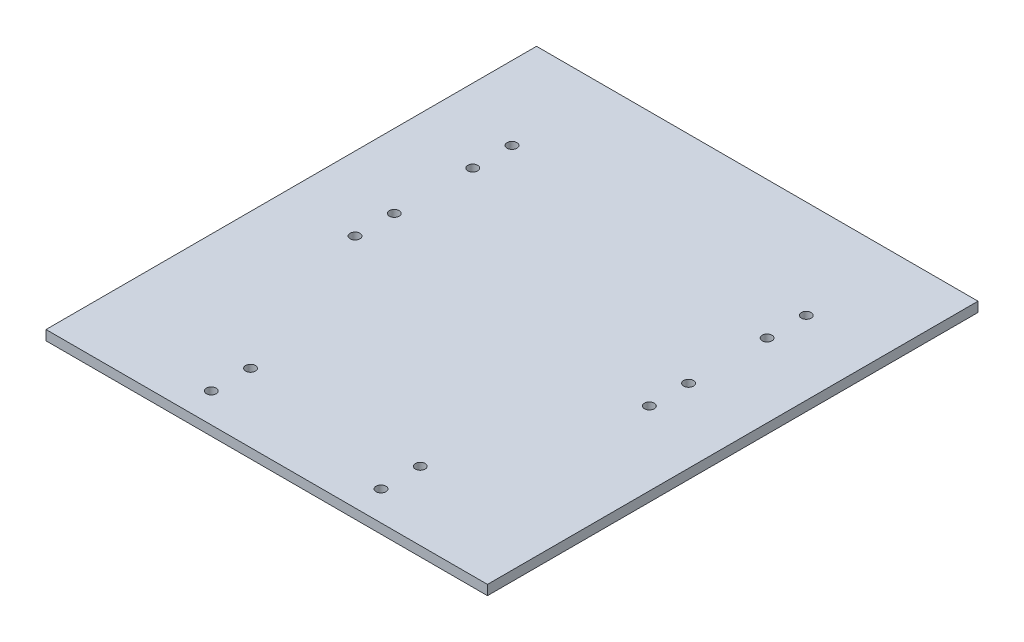
ISO-10303-21;
HEADER;
FILE_DESCRIPTION(('STEP AP214'),'2;1');
FILE_NAME('part.step','',(''),(''),'','','');
FILE_SCHEMA(('AUTOMOTIVE_DESIGN { 1 0 10303 214 1 1 1 1 }'));
ENDSEC;
DATA;
#1=APPLICATION_CONTEXT('core data for automotive mechanical design processes');
#2=APPLICATION_PROTOCOL_DEFINITION('international standard','automotive_design',2000,#1);
#3=PRODUCT_CONTEXT('',#1,'mechanical');
#4=PRODUCT('Part','Part','',(#3));
#5=PRODUCT_RELATED_PRODUCT_CATEGORY('part','',(#4));
#6=PRODUCT_DEFINITION_FORMATION('','',#4);
#7=PRODUCT_DEFINITION_CONTEXT('part definition',#1,'design');
#8=PRODUCT_DEFINITION('design','',#6,#7);
#9=PRODUCT_DEFINITION_SHAPE('','',#8);
#10=(LENGTH_UNIT() NAMED_UNIT(*) SI_UNIT(.MILLI.,.METRE.));
#11=(NAMED_UNIT(*) PLANE_ANGLE_UNIT() SI_UNIT($,.RADIAN.));
#12=(NAMED_UNIT(*) SI_UNIT($,.STERADIAN.) SOLID_ANGLE_UNIT());
#13=UNCERTAINTY_MEASURE_WITH_UNIT(LENGTH_MEASURE(1.E-05),#10,'distance_accuracy_value','');
#14=(GEOMETRIC_REPRESENTATION_CONTEXT(3) GLOBAL_UNCERTAINTY_ASSIGNED_CONTEXT((#13)) GLOBAL_UNIT_ASSIGNED_CONTEXT((#10,
#11,#12)) REPRESENTATION_CONTEXT('',''));
#15=CARTESIAN_POINT('',(0.,0.,0.));
#16=DIRECTION('',(0.,0.,1.));
#17=DIRECTION('',(1.,0.,0.));
#18=AXIS2_PLACEMENT_3D('',#15,#16,#17);
#19=CARTESIAN_POINT('',(-112.5,5.,125.));
#20=DIRECTION('',(1.,0.,0.));
#21=DIRECTION('',(0.,0.,-1.));
#22=AXIS2_PLACEMENT_3D('',#19,#20,#21);
#23=PLANE('',#22);
#24=DIRECTION('',(0.,0.,1.));
#25=VECTOR('',#24,1.);
#26=CARTESIAN_POINT('',(-112.5,0.,125.));
#27=LINE('',#26,#25);
#28=CARTESIAN_POINT('',(-112.5,0.,-125.));
#29=VERTEX_POINT('',#28);
#30=CARTESIAN_POINT('',(-112.5,0.,125.));
#31=VERTEX_POINT('',#30);
#32=EDGE_CURVE('E98',#29,#31,#27,.T.);
#33=ORIENTED_EDGE('',*,*,#32,.T.);
#34=DIRECTION('',(0.,-1.,0.));
#35=VECTOR('',#34,1.);
#36=CARTESIAN_POINT('',(-112.5,5.,125.));
#37=LINE('',#36,#35);
#38=CARTESIAN_POINT('',(-112.5,5.,125.));
#39=VERTEX_POINT('',#38);
#40=EDGE_CURVE('E11',#39,#31,#37,.T.);
#41=ORIENTED_EDGE('',*,*,#40,.F.);
#42=DIRECTION('',(0.,0.,1.));
#43=VECTOR('',#42,1.);
#44=CARTESIAN_POINT('',(-112.5,5.,125.));
#45=LINE('',#44,#43);
#46=CARTESIAN_POINT('',(-112.5,5.,-125.));
#47=VERTEX_POINT('',#46);
#48=EDGE_CURVE('E86',#47,#39,#45,.T.);
#49=ORIENTED_EDGE('',*,*,#48,.F.);
#50=DIRECTION('',(0.,-1.,0.));
#51=VECTOR('',#50,1.);
#52=CARTESIAN_POINT('',(-112.5,5.,-125.));
#53=LINE('',#52,#51);
#54=EDGE_CURVE('E94',#47,#29,#53,.T.);
#55=ORIENTED_EDGE('',*,*,#54,.T.);
#56=EDGE_LOOP('',(#33,#41,#49,#55));
#57=FACE_BOUND('',#56,.T.);
#58=ADVANCED_FACE('F35',(#57),#23,.F.);
#59=CARTESIAN_POINT('',(112.5,5.,125.));
#60=DIRECTION('',(0.,0.,-1.));
#61=DIRECTION('',(-1.,0.,0.));
#62=AXIS2_PLACEMENT_3D('',#59,#60,#61);
#63=PLANE('',#62);
#64=DIRECTION('',(1.,0.,0.));
#65=VECTOR('',#64,1.);
#66=CARTESIAN_POINT('',(112.5,0.,125.));
#67=LINE('',#66,#65);
#68=CARTESIAN_POINT('',(112.5,0.,125.));
#69=VERTEX_POINT('',#68);
#70=EDGE_CURVE('E90',#31,#69,#67,.T.);
#71=ORIENTED_EDGE('',*,*,#70,.T.);
#72=DIRECTION('',(0.,-1.,0.));
#73=VECTOR('',#72,1.);
#74=CARTESIAN_POINT('',(112.5,5.,125.));
#75=LINE('',#74,#73);
#76=CARTESIAN_POINT('',(112.5,5.,125.));
#77=VERTEX_POINT('',#76);
#78=EDGE_CURVE('E43',#77,#69,#75,.T.);
#79=ORIENTED_EDGE('',*,*,#78,.F.);
#80=DIRECTION('',(1.,0.,0.));
#81=VECTOR('',#80,1.);
#82=CARTESIAN_POINT('',(112.5,5.,125.));
#83=LINE('',#82,#81);
#84=EDGE_CURVE('E81',#39,#77,#83,.T.);
#85=ORIENTED_EDGE('',*,*,#84,.F.);
#86=ORIENTED_EDGE('',*,*,#40,.T.);
#87=EDGE_LOOP('',(#71,#79,#85,#86));
#88=FACE_BOUND('',#87,.T.);
#89=ADVANCED_FACE('F89',(#88),#63,.F.);
#90=CARTESIAN_POINT('',(112.5,5.,125.));
#91=DIRECTION('',(-1.,0.,0.));
#92=DIRECTION('',(0.,0.,1.));
#93=AXIS2_PLACEMENT_3D('',#90,#91,#92);
#94=PLANE('',#93);
#95=DIRECTION('',(0.,0.,-1.));
#96=VECTOR('',#95,1.);
#97=CARTESIAN_POINT('',(112.5,0.,125.));
#98=LINE('',#97,#96);
#99=CARTESIAN_POINT('',(112.5,0.,-125.));
#100=VERTEX_POINT('',#99);
#101=EDGE_CURVE('E68',#69,#100,#98,.T.);
#102=ORIENTED_EDGE('',*,*,#101,.T.);
#103=DIRECTION('',(0.,-1.,0.));
#104=VECTOR('',#103,1.);
#105=CARTESIAN_POINT('',(112.5,5.,-125.));
#106=LINE('',#105,#104);
#107=CARTESIAN_POINT('',(112.5,5.,-125.));
#108=VERTEX_POINT('',#107);
#109=EDGE_CURVE('E91',#108,#100,#106,.T.);
#110=ORIENTED_EDGE('',*,*,#109,.F.);
#111=DIRECTION('',(0.,0.,-1.));
#112=VECTOR('',#111,1.);
#113=CARTESIAN_POINT('',(112.5,5.,125.));
#114=LINE('',#113,#112);
#115=EDGE_CURVE('E84',#77,#108,#114,.T.);
#116=ORIENTED_EDGE('',*,*,#115,.F.);
#117=ORIENTED_EDGE('',*,*,#78,.T.);
#118=EDGE_LOOP('',(#102,#110,#116,#117));
#119=FACE_BOUND('',#118,.T.);
#120=ADVANCED_FACE('F92',(#119),#94,.F.);
#121=CARTESIAN_POINT('',(112.5,5.,-125.));
#122=DIRECTION('',(0.,0.,1.));
#123=DIRECTION('',(1.,0.,0.));
#124=AXIS2_PLACEMENT_3D('',#121,#122,#123);
#125=PLANE('',#124);
#126=DIRECTION('',(-1.,0.,0.));
#127=VECTOR('',#126,1.);
#128=CARTESIAN_POINT('',(112.5,0.,-125.));
#129=LINE('',#128,#127);
#130=EDGE_CURVE('E74',#100,#29,#129,.T.);
#131=ORIENTED_EDGE('',*,*,#130,.T.);
#132=ORIENTED_EDGE('',*,*,#54,.F.);
#133=DIRECTION('',(-1.,0.,0.));
#134=VECTOR('',#133,1.);
#135=CARTESIAN_POINT('',(112.5,5.,-125.));
#136=LINE('',#135,#134);
#137=EDGE_CURVE('E51',#108,#47,#136,.T.);
#138=ORIENTED_EDGE('',*,*,#137,.F.);
#139=ORIENTED_EDGE('',*,*,#109,.T.);
#140=EDGE_LOOP('',(#131,#132,#138,#139));
#141=FACE_BOUND('',#140,.T.);
#142=ADVANCED_FACE('F106',(#141),#125,.F.);
#143=CARTESIAN_POINT('',(0.,5.,0.));
#144=DIRECTION('',(0.,1.,0.));
#145=DIRECTION('',(0.,0.,1.));
#146=AXIS2_PLACEMENT_3D('',#143,#144,#145);
#147=PLANE('',#146);
#148=CARTESIAN_POINT('',(-43.25,5.,110.));
#149=DIRECTION('',(0.,1.,0.));
#150=DIRECTION('',(0.,0.,1.));
#151=AXIS2_PLACEMENT_3D('',#148,#149,#150);
#152=CIRCLE('',#151,2.5);
#153=CARTESIAN_POINT('',(-43.25,5.,112.5));
#154=VERTEX_POINT('',#153);
#155=EDGE_CURVE('E173',#154,#154,#152,.T.);
#156=ORIENTED_EDGE('',*,*,#155,.F.);
#157=EDGE_LOOP('',(#156));
#158=FACE_BOUND('',#157,.T.);
#159=CARTESIAN_POINT('',(43.2500000000033,5.,90.));
#160=DIRECTION('',(0.,1.,0.));
#161=DIRECTION('',(0.,0.,-1.));
#162=AXIS2_PLACEMENT_3D('',#159,#160,#161);
#163=CIRCLE('',#162,2.49999999999994);
#164=CARTESIAN_POINT('',(43.2500000000033,5.,87.5000000000001));
#165=VERTEX_POINT('',#164);
#166=EDGE_CURVE('E166',#165,#165,#163,.T.);
#167=ORIENTED_EDGE('',*,*,#166,.F.);
#168=EDGE_LOOP('',(#167));
#169=FACE_BOUND('',#168,.T.);
#170=CARTESIAN_POINT('',(43.25,5.,110.));
#171=DIRECTION('',(0.,1.,0.));
#172=DIRECTION('',(0.,0.,-1.));
#173=AXIS2_PLACEMENT_3D('',#170,#171,#172);
#174=CIRCLE('',#173,2.49999999999992);
#175=CARTESIAN_POINT('',(43.25,5.,107.5));
#176=VERTEX_POINT('',#175);
#177=EDGE_CURVE('E178',#176,#176,#174,.T.);
#178=ORIENTED_EDGE('',*,*,#177,.F.);
#179=EDGE_LOOP('',(#178));
#180=FACE_BOUND('',#179,.T.);
#181=CARTESIAN_POINT('',(-43.25,5.,90.));
#182=DIRECTION('',(0.,1.,0.));
#183=DIRECTION('',(0.,0.,1.));
#184=AXIS2_PLACEMENT_3D('',#181,#182,#183);
#185=CIRCLE('',#184,2.5);
#186=CARTESIAN_POINT('',(-43.25,5.,92.5));
#187=VERTEX_POINT('',#186);
#188=EDGE_CURVE('E160',#187,#187,#185,.T.);
#189=ORIENTED_EDGE('',*,*,#188,.F.);
#190=EDGE_LOOP('',(#189));
#191=FACE_BOUND('',#190,.T.);
#192=CARTESIAN_POINT('',(75.0000000000133,5.,4.99999999999999));
#193=DIRECTION('',(0.,1.,0.));
#194=DIRECTION('',(0.,0.,1.));
#195=AXIS2_PLACEMENT_3D('',#192,#193,#194);
#196=CIRCLE('',#195,2.49999999999999);
#197=CARTESIAN_POINT('',(75.0000000000133,5.,7.49999999999998));
#198=VERTEX_POINT('',#197);
#199=EDGE_CURVE('E130',#198,#198,#196,.T.);
#200=ORIENTED_EDGE('',*,*,#199,.F.);
#201=EDGE_LOOP('',(#200));
#202=FACE_BOUND('',#201,.T.);
#203=CARTESIAN_POINT('',(75.0000000000133,5.,-75.));
#204=DIRECTION('',(0.,1.,0.));
#205=DIRECTION('',(0.,0.,-1.));
#206=AXIS2_PLACEMENT_3D('',#203,#204,#205);
#207=CIRCLE('',#206,2.5);
#208=CARTESIAN_POINT('',(75.0000000000133,5.,-77.5));
#209=VERTEX_POINT('',#208);
#210=EDGE_CURVE('E137',#209,#209,#207,.T.);
#211=ORIENTED_EDGE('',*,*,#210,.F.);
#212=EDGE_LOOP('',(#211));
#213=FACE_BOUND('',#212,.T.);
#214=CARTESIAN_POINT('',(75.0000000000133,5.,-55.));
#215=DIRECTION('',(0.,1.,0.));
#216=DIRECTION('',(0.,0.,-1.));
#217=AXIS2_PLACEMENT_3D('',#214,#215,#216);
#218=CIRCLE('',#217,2.50000000000001);
#219=CARTESIAN_POINT('',(75.0000000000133,5.,-57.5));
#220=VERTEX_POINT('',#219);
#221=EDGE_CURVE('E118',#220,#220,#218,.T.);
#222=ORIENTED_EDGE('',*,*,#221,.F.);
#223=EDGE_LOOP('',(#222));
#224=FACE_BOUND('',#223,.T.);
#225=CARTESIAN_POINT('',(-75.0000000000133,5.,-55.));
#226=DIRECTION('',(0.,1.,0.));
#227=DIRECTION('',(0.,0.,1.));
#228=AXIS2_PLACEMENT_3D('',#225,#226,#227);
#229=CIRCLE('',#228,2.50000000000001);
#230=CARTESIAN_POINT('',(-75.0000000000133,5.,-52.5));
#231=VERTEX_POINT('',#230);
#232=EDGE_CURVE('E125',#231,#231,#229,.T.);
#233=ORIENTED_EDGE('',*,*,#232,.F.);
#234=EDGE_LOOP('',(#233));
#235=FACE_BOUND('',#234,.T.);
#236=CARTESIAN_POINT('',(-75.0000000000133,5.,-15.));
#237=DIRECTION('',(0.,1.,0.));
#238=DIRECTION('',(0.,0.,-1.));
#239=AXIS2_PLACEMENT_3D('',#236,#237,#238);
#240=CIRCLE('',#239,2.50000000000001);
#241=CARTESIAN_POINT('',(-75.0000000000133,5.,-17.5));
#242=VERTEX_POINT('',#241);
#243=EDGE_CURVE('E154',#242,#242,#240,.T.);
#244=ORIENTED_EDGE('',*,*,#243,.F.);
#245=EDGE_LOOP('',(#244));
#246=FACE_BOUND('',#245,.T.);
#247=CARTESIAN_POINT('',(-75.0000000000133,5.,4.99999999999999));
#248=DIRECTION('',(0.,1.,0.));
#249=DIRECTION('',(0.,0.,-1.));
#250=AXIS2_PLACEMENT_3D('',#247,#248,#249);
#251=CIRCLE('',#250,2.49999999999999);
#252=CARTESIAN_POINT('',(-75.0000000000133,5.,2.5));
#253=VERTEX_POINT('',#252);
#254=EDGE_CURVE('E142',#253,#253,#251,.T.);
#255=ORIENTED_EDGE('',*,*,#254,.F.);
#256=EDGE_LOOP('',(#255));
#257=FACE_BOUND('',#256,.T.);
#258=CARTESIAN_POINT('',(75.0000000000133,5.,-15.));
#259=DIRECTION('',(0.,1.,0.));
#260=DIRECTION('',(0.,0.,1.));
#261=AXIS2_PLACEMENT_3D('',#258,#259,#260);
#262=CIRCLE('',#261,2.50000000000001);
#263=CARTESIAN_POINT('',(75.0000000000133,5.,-12.5));
#264=VERTEX_POINT('',#263);
#265=EDGE_CURVE('E149',#264,#264,#262,.T.);
#266=ORIENTED_EDGE('',*,*,#265,.F.);
#267=EDGE_LOOP('',(#266));
#268=FACE_BOUND('',#267,.T.);
#269=CARTESIAN_POINT('',(-75.0000000000133,5.,-75.));
#270=DIRECTION('',(0.,1.,0.));
#271=DIRECTION('',(0.,0.,1.));
#272=AXIS2_PLACEMENT_3D('',#269,#270,#271);
#273=CIRCLE('',#272,2.5);
#274=CARTESIAN_POINT('',(-75.0000000000133,5.,-72.5));
#275=VERTEX_POINT('',#274);
#276=EDGE_CURVE('E112',#275,#275,#273,.T.);
#277=ORIENTED_EDGE('',*,*,#276,.F.);
#278=EDGE_LOOP('',(#277));
#279=FACE_BOUND('',#278,.T.);
#280=ORIENTED_EDGE('',*,*,#48,.T.);
#281=ORIENTED_EDGE('',*,*,#84,.T.);
#282=ORIENTED_EDGE('',*,*,#115,.T.);
#283=ORIENTED_EDGE('',*,*,#137,.T.);
#284=EDGE_LOOP('',(#280,#281,#282,#283));
#285=FACE_BOUND('',#284,.T.);
#286=ADVANCED_FACE('F82',(#158,#169,#180,#191,#202,#213,#224,#235,#246,#257,#268,#279,#285),
#147,.T.);
#287=CARTESIAN_POINT('',(0.,0.,0.));
#288=DIRECTION('',(0.,1.,0.));
#289=DIRECTION('',(0.,0.,1.));
#290=AXIS2_PLACEMENT_3D('',#287,#288,#289);
#291=PLANE('',#290);
#292=CARTESIAN_POINT('',(-43.25,0.,110.));
#293=DIRECTION('',(0.,1.,0.));
#294=DIRECTION('',(0.,0.,1.));
#295=AXIS2_PLACEMENT_3D('',#292,#293,#294);
#296=CIRCLE('',#295,2.5);
#297=CARTESIAN_POINT('',(-43.25,0.,112.5));
#298=VERTEX_POINT('',#297);
#299=EDGE_CURVE('E163',#298,#298,#296,.T.);
#300=ORIENTED_EDGE('',*,*,#299,.T.);
#301=EDGE_LOOP('',(#300));
#302=FACE_BOUND('',#301,.T.);
#303=CARTESIAN_POINT('',(43.2500000000033,0.,90.));
#304=DIRECTION('',(0.,1.,0.));
#305=DIRECTION('',(0.,0.,-1.));
#306=AXIS2_PLACEMENT_3D('',#303,#304,#305);
#307=CIRCLE('',#306,2.49999999999994);
#308=CARTESIAN_POINT('',(43.2500000000033,0.,87.5000000000001));
#309=VERTEX_POINT('',#308);
#310=EDGE_CURVE('E169',#309,#309,#307,.T.);
#311=ORIENTED_EDGE('',*,*,#310,.T.);
#312=EDGE_LOOP('',(#311));
#313=FACE_BOUND('',#312,.T.);
#314=CARTESIAN_POINT('',(43.25,0.,110.));
#315=DIRECTION('',(0.,1.,0.));
#316=DIRECTION('',(0.,0.,-1.));
#317=AXIS2_PLACEMENT_3D('',#314,#315,#316);
#318=CIRCLE('',#317,2.49999999999992);
#319=CARTESIAN_POINT('',(43.25,0.,107.5));
#320=VERTEX_POINT('',#319);
#321=EDGE_CURVE('E170',#320,#320,#318,.T.);
#322=ORIENTED_EDGE('',*,*,#321,.T.);
#323=EDGE_LOOP('',(#322));
#324=FACE_BOUND('',#323,.T.);
#325=CARTESIAN_POINT('',(-43.25,0.,90.));
#326=DIRECTION('',(0.,1.,0.));
#327=DIRECTION('',(0.,0.,1.));
#328=AXIS2_PLACEMENT_3D('',#325,#326,#327);
#329=CIRCLE('',#328,2.5);
#330=CARTESIAN_POINT('',(-43.25,0.,92.5));
#331=VERTEX_POINT('',#330);
#332=EDGE_CURVE('E157',#331,#331,#329,.T.);
#333=ORIENTED_EDGE('',*,*,#332,.T.);
#334=EDGE_LOOP('',(#333));
#335=FACE_BOUND('',#334,.T.);
#336=CARTESIAN_POINT('',(75.0000000000133,0.,4.99999999999999));
#337=DIRECTION('',(0.,1.,0.));
#338=DIRECTION('',(0.,0.,1.));
#339=AXIS2_PLACEMENT_3D('',#336,#337,#338);
#340=CIRCLE('',#339,2.49999999999999);
#341=CARTESIAN_POINT('',(75.0000000000133,0.,7.49999999999998));
#342=VERTEX_POINT('',#341);
#343=EDGE_CURVE('E133',#342,#342,#340,.T.);
#344=ORIENTED_EDGE('',*,*,#343,.T.);
#345=EDGE_LOOP('',(#344));
#346=FACE_BOUND('',#345,.T.);
#347=CARTESIAN_POINT('',(75.0000000000133,0.,-75.));
#348=DIRECTION('',(0.,1.,0.));
#349=DIRECTION('',(0.,0.,-1.));
#350=AXIS2_PLACEMENT_3D('',#347,#348,#349);
#351=CIRCLE('',#350,2.5);
#352=CARTESIAN_POINT('',(75.0000000000133,0.,-77.5));
#353=VERTEX_POINT('',#352);
#354=EDGE_CURVE('E122',#353,#353,#351,.T.);
#355=ORIENTED_EDGE('',*,*,#354,.T.);
#356=EDGE_LOOP('',(#355));
#357=FACE_BOUND('',#356,.T.);
#358=CARTESIAN_POINT('',(75.0000000000133,0.,-55.));
#359=DIRECTION('',(0.,1.,0.));
#360=DIRECTION('',(0.,0.,-1.));
#361=AXIS2_PLACEMENT_3D('',#358,#359,#360);
#362=CIRCLE('',#361,2.50000000000001);
#363=CARTESIAN_POINT('',(75.0000000000133,0.,-57.5));
#364=VERTEX_POINT('',#363);
#365=EDGE_CURVE('E121',#364,#364,#362,.T.);
#366=ORIENTED_EDGE('',*,*,#365,.T.);
#367=EDGE_LOOP('',(#366));
#368=FACE_BOUND('',#367,.T.);
#369=CARTESIAN_POINT('',(-75.0000000000133,0.,-55.));
#370=DIRECTION('',(0.,1.,0.));
#371=DIRECTION('',(0.,0.,1.));
#372=AXIS2_PLACEMENT_3D('',#369,#370,#371);
#373=CIRCLE('',#372,2.50000000000001);
#374=CARTESIAN_POINT('',(-75.0000000000133,0.,-52.5));
#375=VERTEX_POINT('',#374);
#376=EDGE_CURVE('E115',#375,#375,#373,.T.);
#377=ORIENTED_EDGE('',*,*,#376,.T.);
#378=EDGE_LOOP('',(#377));
#379=FACE_BOUND('',#378,.T.);
#380=CARTESIAN_POINT('',(-75.0000000000133,0.,-15.));
#381=DIRECTION('',(0.,1.,0.));
#382=DIRECTION('',(0.,0.,-1.));
#383=AXIS2_PLACEMENT_3D('',#380,#381,#382);
#384=CIRCLE('',#383,2.50000000000001);
#385=CARTESIAN_POINT('',(-75.0000000000133,0.,-17.5));
#386=VERTEX_POINT('',#385);
#387=EDGE_CURVE('E146',#386,#386,#384,.T.);
#388=ORIENTED_EDGE('',*,*,#387,.T.);
#389=EDGE_LOOP('',(#388));
#390=FACE_BOUND('',#389,.T.);
#391=CARTESIAN_POINT('',(-75.0000000000133,0.,4.99999999999999));
#392=DIRECTION('',(0.,1.,0.));
#393=DIRECTION('',(0.,0.,-1.));
#394=AXIS2_PLACEMENT_3D('',#391,#392,#393);
#395=CIRCLE('',#394,2.49999999999999);
#396=CARTESIAN_POINT('',(-75.0000000000133,0.,2.5));
#397=VERTEX_POINT('',#396);
#398=EDGE_CURVE('E145',#397,#397,#395,.T.);
#399=ORIENTED_EDGE('',*,*,#398,.T.);
#400=EDGE_LOOP('',(#399));
#401=FACE_BOUND('',#400,.T.);
#402=CARTESIAN_POINT('',(75.0000000000133,0.,-15.));
#403=DIRECTION('',(0.,1.,0.));
#404=DIRECTION('',(0.,0.,1.));
#405=AXIS2_PLACEMENT_3D('',#402,#403,#404);
#406=CIRCLE('',#405,2.50000000000001);
#407=CARTESIAN_POINT('',(75.0000000000133,0.,-12.5));
#408=VERTEX_POINT('',#407);
#409=EDGE_CURVE('E134',#408,#408,#406,.T.);
#410=ORIENTED_EDGE('',*,*,#409,.T.);
#411=EDGE_LOOP('',(#410));
#412=FACE_BOUND('',#411,.T.);
#413=CARTESIAN_POINT('',(-75.0000000000133,0.,-75.));
#414=DIRECTION('',(0.,1.,0.));
#415=DIRECTION('',(0.,0.,1.));
#416=AXIS2_PLACEMENT_3D('',#413,#414,#415);
#417=CIRCLE('',#416,2.5);
#418=CARTESIAN_POINT('',(-75.0000000000133,0.,-72.5));
#419=VERTEX_POINT('',#418);
#420=EDGE_CURVE('E101',#419,#419,#417,.T.);
#421=ORIENTED_EDGE('',*,*,#420,.T.);
#422=EDGE_LOOP('',(#421));
#423=FACE_BOUND('',#422,.T.);
#424=ORIENTED_EDGE('',*,*,#32,.F.);
#425=ORIENTED_EDGE('',*,*,#130,.F.);
#426=ORIENTED_EDGE('',*,*,#101,.F.);
#427=ORIENTED_EDGE('',*,*,#70,.F.);
#428=EDGE_LOOP('',(#424,#425,#426,#427));
#429=FACE_BOUND('',#428,.T.);
#430=ADVANCED_FACE('F109',(#302,#313,#324,#335,#346,#357,#368,#379,#390,#401,#412,#423,#429),
#291,.F.);
#431=CARTESIAN_POINT('',(-75.0000000000133,0.,-75.));
#432=DIRECTION('',(0.,1.,0.));
#433=DIRECTION('',(0.,0.,1.));
#434=AXIS2_PLACEMENT_3D('',#431,#432,#433);
#435=CYLINDRICAL_SURFACE('',#434,2.5);
#436=ORIENTED_EDGE('',*,*,#420,.F.);
#437=EDGE_LOOP('',(#436));
#438=FACE_BOUND('',#437,.T.);
#439=ORIENTED_EDGE('',*,*,#276,.T.);
#440=EDGE_LOOP('',(#439));
#441=FACE_BOUND('',#440,.T.);
#442=ADVANCED_FACE('F216',(#438,#441),#435,.F.);
#443=CARTESIAN_POINT('',(75.0000000000133,0.,-15.));
#444=DIRECTION('',(0.,1.,0.));
#445=DIRECTION('',(0.,0.,1.));
#446=AXIS2_PLACEMENT_3D('',#443,#444,#445);
#447=CYLINDRICAL_SURFACE('',#446,2.50000000000001);
#448=ORIENTED_EDGE('',*,*,#409,.F.);
#449=EDGE_LOOP('',(#448));
#450=FACE_BOUND('',#449,.T.);
#451=ORIENTED_EDGE('',*,*,#265,.T.);
#452=EDGE_LOOP('',(#451));
#453=FACE_BOUND('',#452,.T.);
#454=ADVANCED_FACE('F218',(#450,#453),#447,.F.);
#455=CARTESIAN_POINT('',(-75.0000000000133,0.,4.99999999999999));
#456=DIRECTION('',(0.,1.,0.));
#457=DIRECTION('',(0.,0.,1.));
#458=AXIS2_PLACEMENT_3D('',#455,#456,#457);
#459=CYLINDRICAL_SURFACE('',#458,2.49999999999999);
#460=ORIENTED_EDGE('',*,*,#398,.F.);
#461=EDGE_LOOP('',(#460));
#462=FACE_BOUND('',#461,.T.);
#463=ORIENTED_EDGE('',*,*,#254,.T.);
#464=EDGE_LOOP('',(#463));
#465=FACE_BOUND('',#464,.T.);
#466=ADVANCED_FACE('F225',(#462,#465),#459,.F.);
#467=CARTESIAN_POINT('',(-75.0000000000133,0.,-15.));
#468=DIRECTION('',(0.,1.,0.));
#469=DIRECTION('',(0.,0.,1.));
#470=AXIS2_PLACEMENT_3D('',#467,#468,#469);
#471=CYLINDRICAL_SURFACE('',#470,2.50000000000001);
#472=ORIENTED_EDGE('',*,*,#387,.F.);
#473=EDGE_LOOP('',(#472));
#474=FACE_BOUND('',#473,.T.);
#475=ORIENTED_EDGE('',*,*,#243,.T.);
#476=EDGE_LOOP('',(#475));
#477=FACE_BOUND('',#476,.T.);
#478=ADVANCED_FACE('F300',(#474,#477),#471,.F.);
#479=CARTESIAN_POINT('',(-75.0000000000133,0.,-55.));
#480=DIRECTION('',(0.,1.,0.));
#481=DIRECTION('',(0.,0.,1.));
#482=AXIS2_PLACEMENT_3D('',#479,#480,#481);
#483=CYLINDRICAL_SURFACE('',#482,2.50000000000001);
#484=ORIENTED_EDGE('',*,*,#376,.F.);
#485=EDGE_LOOP('',(#484));
#486=FACE_BOUND('',#485,.T.);
#487=ORIENTED_EDGE('',*,*,#232,.T.);
#488=EDGE_LOOP('',(#487));
#489=FACE_BOUND('',#488,.T.);
#490=ADVANCED_FACE('F302',(#486,#489),#483,.F.);
#491=CARTESIAN_POINT('',(75.0000000000133,0.,-55.));
#492=DIRECTION('',(0.,1.,0.));
#493=DIRECTION('',(0.,0.,1.));
#494=AXIS2_PLACEMENT_3D('',#491,#492,#493);
#495=CYLINDRICAL_SURFACE('',#494,2.50000000000001);
#496=ORIENTED_EDGE('',*,*,#365,.F.);
#497=EDGE_LOOP('',(#496));
#498=FACE_BOUND('',#497,.T.);
#499=ORIENTED_EDGE('',*,*,#221,.T.);
#500=EDGE_LOOP('',(#499));
#501=FACE_BOUND('',#500,.T.);
#502=ADVANCED_FACE('F311',(#498,#501),#495,.F.);
#503=CARTESIAN_POINT('',(75.0000000000133,0.,-75.));
#504=DIRECTION('',(0.,1.,0.));
#505=DIRECTION('',(0.,0.,1.));
#506=AXIS2_PLACEMENT_3D('',#503,#504,#505);
#507=CYLINDRICAL_SURFACE('',#506,2.5);
#508=ORIENTED_EDGE('',*,*,#354,.F.);
#509=EDGE_LOOP('',(#508));
#510=FACE_BOUND('',#509,.T.);
#511=ORIENTED_EDGE('',*,*,#210,.T.);
#512=EDGE_LOOP('',(#511));
#513=FACE_BOUND('',#512,.T.);
#514=ADVANCED_FACE('F308',(#510,#513),#507,.F.);
#515=CARTESIAN_POINT('',(75.0000000000133,0.,4.99999999999999));
#516=DIRECTION('',(0.,1.,0.));
#517=DIRECTION('',(0.,0.,1.));
#518=AXIS2_PLACEMENT_3D('',#515,#516,#517);
#519=CYLINDRICAL_SURFACE('',#518,2.49999999999999);
#520=ORIENTED_EDGE('',*,*,#343,.F.);
#521=EDGE_LOOP('',(#520));
#522=FACE_BOUND('',#521,.T.);
#523=ORIENTED_EDGE('',*,*,#199,.T.);
#524=EDGE_LOOP('',(#523));
#525=FACE_BOUND('',#524,.T.);
#526=ADVANCED_FACE('F265',(#522,#525),#519,.F.);
#527=CARTESIAN_POINT('',(-43.25,0.,90.));
#528=DIRECTION('',(0.,1.,0.));
#529=DIRECTION('',(0.,0.,1.));
#530=AXIS2_PLACEMENT_3D('',#527,#528,#529);
#531=CYLINDRICAL_SURFACE('',#530,2.5);
#532=ORIENTED_EDGE('',*,*,#332,.F.);
#533=EDGE_LOOP('',(#532));
#534=FACE_BOUND('',#533,.T.);
#535=ORIENTED_EDGE('',*,*,#188,.T.);
#536=EDGE_LOOP('',(#535));
#537=FACE_BOUND('',#536,.T.);
#538=ADVANCED_FACE('F190',(#534,#537),#531,.F.);
#539=CARTESIAN_POINT('',(43.25,0.,110.));
#540=DIRECTION('',(0.,1.,0.));
#541=DIRECTION('',(0.,0.,1.));
#542=AXIS2_PLACEMENT_3D('',#539,#540,#541);
#543=CYLINDRICAL_SURFACE('',#542,2.49999999999992);
#544=ORIENTED_EDGE('',*,*,#321,.F.);
#545=EDGE_LOOP('',(#544));
#546=FACE_BOUND('',#545,.T.);
#547=ORIENTED_EDGE('',*,*,#177,.T.);
#548=EDGE_LOOP('',(#547));
#549=FACE_BOUND('',#548,.T.);
#550=ADVANCED_FACE('F186',(#546,#549),#543,.F.);
#551=CARTESIAN_POINT('',(43.2500000000033,0.,90.));
#552=DIRECTION('',(0.,1.,0.));
#553=DIRECTION('',(0.,0.,1.));
#554=AXIS2_PLACEMENT_3D('',#551,#552,#553);
#555=CYLINDRICAL_SURFACE('',#554,2.49999999999994);
#556=ORIENTED_EDGE('',*,*,#310,.F.);
#557=EDGE_LOOP('',(#556));
#558=FACE_BOUND('',#557,.T.);
#559=ORIENTED_EDGE('',*,*,#166,.T.);
#560=EDGE_LOOP('',(#559));
#561=FACE_BOUND('',#560,.T.);
#562=ADVANCED_FACE('F189',(#558,#561),#555,.F.);
#563=CARTESIAN_POINT('',(-43.25,0.,110.));
#564=DIRECTION('',(0.,1.,0.));
#565=DIRECTION('',(0.,0.,1.));
#566=AXIS2_PLACEMENT_3D('',#563,#564,#565);
#567=CYLINDRICAL_SURFACE('',#566,2.5);
#568=ORIENTED_EDGE('',*,*,#299,.F.);
#569=EDGE_LOOP('',(#568));
#570=FACE_BOUND('',#569,.T.);
#571=ORIENTED_EDGE('',*,*,#155,.T.);
#572=EDGE_LOOP('',(#571));
#573=FACE_BOUND('',#572,.T.);
#574=ADVANCED_FACE('F283',(#570,#573),#567,.F.);
#575=CLOSED_SHELL('',(#58,#89,#120,#142,#286,#430,#442,#454,#466,#478,#490,#502,#514,#526,#538,
#550,#562,#574));
#576=MANIFOLD_SOLID_BREP('B2',#575);
#577=ADVANCED_BREP_SHAPE_REPRESENTATION('',(#18,#576),#14);
#578=SHAPE_DEFINITION_REPRESENTATION(#9,#577);
ENDSEC;
END-ISO-10303-21;
